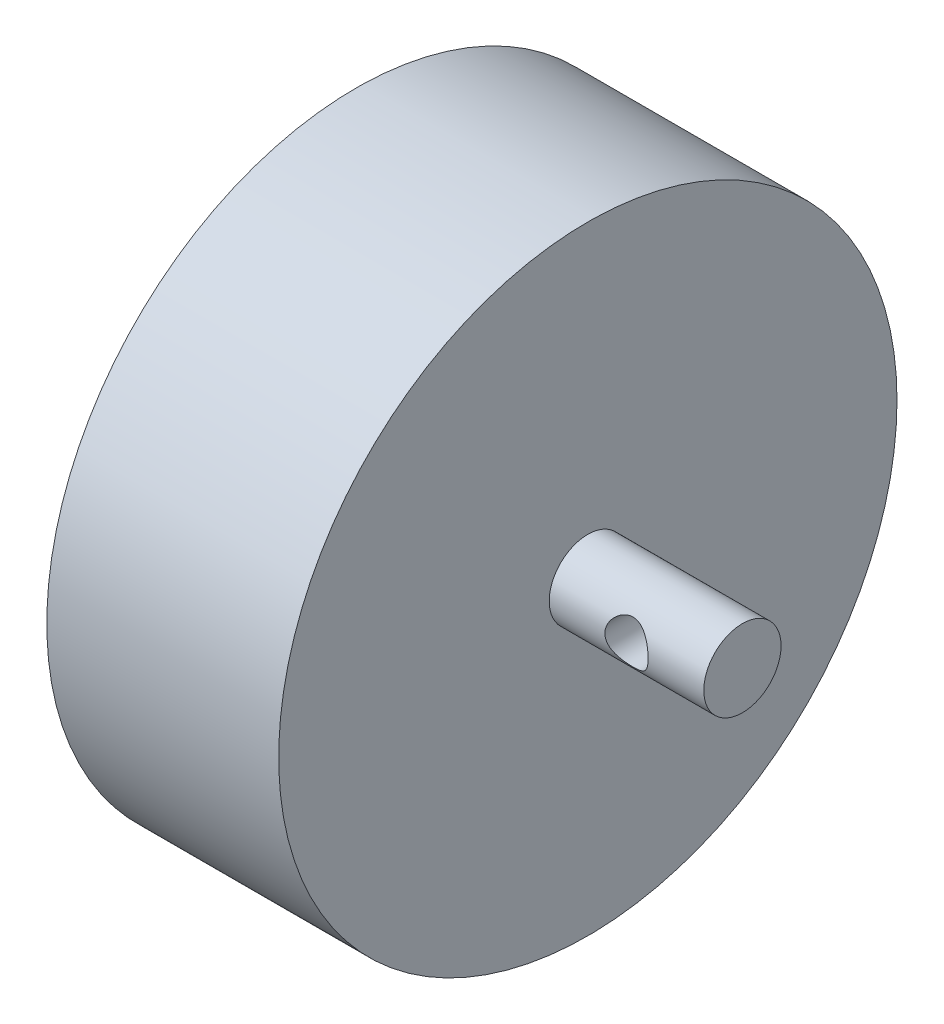
ISO-10303-21;
HEADER;
FILE_DESCRIPTION(('STEP AP214'),'2;1');
FILE_NAME('part.step','',(''),(''),'','','');
FILE_SCHEMA(('AUTOMOTIVE_DESIGN { 1 0 10303 214 1 1 1 1 }'));
ENDSEC;
DATA;
#1=APPLICATION_CONTEXT('core data for automotive mechanical design processes');
#2=APPLICATION_PROTOCOL_DEFINITION('international standard','automotive_design',2000,#1);
#3=PRODUCT_CONTEXT('',#1,'mechanical');
#4=PRODUCT('Part','Part','',(#3));
#5=PRODUCT_RELATED_PRODUCT_CATEGORY('part','',(#4));
#6=PRODUCT_DEFINITION_FORMATION('','',#4);
#7=PRODUCT_DEFINITION_CONTEXT('part definition',#1,'design');
#8=PRODUCT_DEFINITION('design','',#6,#7);
#9=PRODUCT_DEFINITION_SHAPE('','',#8);
#10=(LENGTH_UNIT() NAMED_UNIT(*) SI_UNIT(.MILLI.,.METRE.));
#11=(NAMED_UNIT(*) PLANE_ANGLE_UNIT() SI_UNIT($,.RADIAN.));
#12=(NAMED_UNIT(*) SI_UNIT($,.STERADIAN.) SOLID_ANGLE_UNIT());
#13=UNCERTAINTY_MEASURE_WITH_UNIT(LENGTH_MEASURE(1.E-05),#10,'distance_accuracy_value','');
#14=(GEOMETRIC_REPRESENTATION_CONTEXT(3) GLOBAL_UNCERTAINTY_ASSIGNED_CONTEXT((#13)) GLOBAL_UNIT_ASSIGNED_CONTEXT((#10,
#11,#12)) REPRESENTATION_CONTEXT('',''));
#15=CARTESIAN_POINT('',(0.,0.,0.));
#16=DIRECTION('',(0.,0.,1.));
#17=DIRECTION('',(1.,0.,0.));
#18=AXIS2_PLACEMENT_3D('',#15,#16,#17);
#19=CARTESIAN_POINT('',(3.,0.,0.));
#20=DIRECTION('',(1.,0.,0.));
#21=DIRECTION('',(0.,0.,-1.));
#22=AXIS2_PLACEMENT_3D('',#19,#20,#21);
#23=PLANE('',#22);
#24=CARTESIAN_POINT('',(3.,0.,6.5));
#25=DIRECTION('',(-1.,0.,0.));
#26=DIRECTION('',(0.,0.,1.));
#27=AXIS2_PLACEMENT_3D('',#24,#25,#26);
#28=CIRCLE('',#27,1.25);
#29=CARTESIAN_POINT('',(3.,0.,7.75));
#30=VERTEX_POINT('',#29);
#31=EDGE_CURVE('E80',#30,#30,#28,.T.);
#32=ORIENTED_EDGE('',*,*,#31,.F.);
#33=EDGE_LOOP('',(#32));
#34=FACE_BOUND('',#33,.T.);
#35=CARTESIAN_POINT('',(3.,-6.5,0.));
#36=DIRECTION('',(-1.,0.,0.));
#37=DIRECTION('',(0.,0.,1.));
#38=AXIS2_PLACEMENT_3D('',#35,#36,#37);
#39=CIRCLE('',#38,1.25);
#40=CARTESIAN_POINT('',(3.,-6.5,1.25));
#41=VERTEX_POINT('',#40);
#42=EDGE_CURVE('E79',#41,#41,#39,.T.);
#43=ORIENTED_EDGE('',*,*,#42,.F.);
#44=EDGE_LOOP('',(#43));
#45=FACE_BOUND('',#44,.T.);
#46=CARTESIAN_POINT('',(3.,0.,-6.5));
#47=DIRECTION('',(-1.,0.,0.));
#48=DIRECTION('',(0.,0.,1.));
#49=AXIS2_PLACEMENT_3D('',#46,#47,#48);
#50=CIRCLE('',#49,1.25);
#51=CARTESIAN_POINT('',(3.,0.,-5.25));
#52=VERTEX_POINT('',#51);
#53=EDGE_CURVE('E90',#52,#52,#50,.T.);
#54=ORIENTED_EDGE('',*,*,#53,.F.);
#55=EDGE_LOOP('',(#54));
#56=FACE_BOUND('',#55,.T.);
#57=CARTESIAN_POINT('',(3.,0.,0.));
#58=DIRECTION('',(1.,0.,0.));
#59=DIRECTION('',(0.,0.,-1.));
#60=AXIS2_PLACEMENT_3D('',#57,#58,#59);
#61=CIRCLE('',#60,3.5);
#62=CARTESIAN_POINT('',(3.,0.,-3.5));
#63=VERTEX_POINT('',#62);
#64=EDGE_CURVE('E11',#63,#63,#61,.T.);
#65=ORIENTED_EDGE('',*,*,#64,.T.);
#66=EDGE_LOOP('',(#65));
#67=FACE_BOUND('',#66,.T.);
#68=CARTESIAN_POINT('',(3.,0.,0.));
#69=DIRECTION('',(1.,0.,0.));
#70=DIRECTION('',(0.,0.,-1.));
#71=AXIS2_PLACEMENT_3D('',#68,#69,#70);
#72=CIRCLE('',#71,20.);
#73=CARTESIAN_POINT('',(3.,0.,-20.));
#74=VERTEX_POINT('',#73);
#75=EDGE_CURVE('E106',#74,#74,#72,.T.);
#76=ORIENTED_EDGE('',*,*,#75,.F.);
#77=EDGE_LOOP('',(#76));
#78=FACE_BOUND('',#77,.T.);
#79=CARTESIAN_POINT('',(3.,6.5,0.));
#80=DIRECTION('',(-1.,0.,0.));
#81=DIRECTION('',(0.,0.,1.));
#82=AXIS2_PLACEMENT_3D('',#79,#80,#81);
#83=CIRCLE('',#82,1.25);
#84=CARTESIAN_POINT('',(3.,6.5,1.25));
#85=VERTEX_POINT('',#84);
#86=EDGE_CURVE('E96',#85,#85,#83,.T.);
#87=ORIENTED_EDGE('',*,*,#86,.F.);
#88=EDGE_LOOP('',(#87));
#89=FACE_BOUND('',#88,.T.);
#90=ADVANCED_FACE('F41',(#34,#45,#56,#67,#78,#89),#23,.F.);
#91=CARTESIAN_POINT('',(28.,0.,0.));
#92=DIRECTION('',(-1.,0.,0.));
#93=DIRECTION('',(0.,0.,1.));
#94=AXIS2_PLACEMENT_3D('',#91,#92,#93);
#95=CYLINDRICAL_SURFACE('',#94,2.5);
#96=CARTESIAN_POINT('',(28.,0.,0.));
#97=DIRECTION('',(1.,0.,0.));
#98=DIRECTION('',(0.,0.,-1.));
#99=AXIS2_PLACEMENT_3D('',#96,#97,#98);
#100=CIRCLE('',#99,2.5);
#101=CARTESIAN_POINT('',(28.,0.,-2.5));
#102=VERTEX_POINT('',#101);
#103=EDGE_CURVE('E103',#102,#102,#100,.T.);
#104=ORIENTED_EDGE('',*,*,#103,.F.);
#105=EDGE_LOOP('',(#104));
#106=FACE_BOUND('',#105,.T.);
#107=CARTESIAN_POINT('',(18.,0.,0.));
#108=DIRECTION('',(1.,0.,0.));
#109=DIRECTION('',(0.,0.,-1.));
#110=AXIS2_PLACEMENT_3D('',#107,#108,#109);
#111=CIRCLE('',#110,2.5);
#112=CARTESIAN_POINT('',(18.,0.,-2.5));
#113=VERTEX_POINT('',#112);
#114=EDGE_CURVE('E107',#113,#113,#111,.T.);
#115=ORIENTED_EDGE('',*,*,#114,.T.);
#116=EDGE_LOOP('',(#115));
#117=FACE_BOUND('',#116,.T.);
#118=CARTESIAN_POINT('',(21.6,0.,-2.5));
#119=CARTESIAN_POINT('',(21.5999971034013,0.0725818689730917,-2.5000025207769));
#120=CARTESIAN_POINT('',(21.6056686696437,0.145147059210999,-2.4968126130914));
#121=CARTESIAN_POINT('',(21.6280397874393,0.288016997267102,-2.48438893882109));
#122=CARTESIAN_POINT('',(21.6447407304683,0.35832145869601,-2.47515440964292));
#123=CARTESIAN_POINT('',(21.6882875901928,0.494475170763166,-2.4515826362878));
#124=CARTESIAN_POINT('',(21.7150961271458,0.560339795458176,-2.4372642045506));
#125=CARTESIAN_POINT('',(21.7778409702233,0.686510478104349,-2.40477714167671));
#126=CARTESIAN_POINT('',(21.8137795115382,0.746815169948826,-2.38660756789146));
#127=CARTESIAN_POINT('',(21.8965929323298,0.864901258370252,-2.34650853836439));
#128=CARTESIAN_POINT('',(21.9440586544966,0.922207928188874,-2.32440463450632));
#129=CARTESIAN_POINT('',(22.047278741539,1.02850336667495,-2.27936832535399));
#130=CARTESIAN_POINT('',(22.1030416344691,1.07748346476577,-2.25643508622409));
#131=CARTESIAN_POINT('',(22.228110571729,1.17085060892693,-2.20954965541892));
#132=CARTESIAN_POINT('',(22.2982207513902,1.21423931000865,-2.18573723286096));
#133=CARTESIAN_POINT('',(22.446118759996,1.28842263311707,-2.14285181690115));
#134=CARTESIAN_POINT('',(22.5238952276818,1.31923555387748,-2.12377195324334));
#135=CARTESIAN_POINT('',(22.6679140789319,1.3616501036544,-2.09675966314441));
#136=CARTESIAN_POINT('',(22.7330793356759,1.37594726130742,-2.08731773527896));
#137=CARTESIAN_POINT('',(22.8653466905762,1.3951063945149,-2.07456424572643));
#138=CARTESIAN_POINT('',(22.9324467656657,1.39997788675499,-2.0712465008732));
#139=CARTESIAN_POINT('',(23.0667273688799,1.40002199297853,-2.07121661581743));
#140=CARTESIAN_POINT('',(23.1339078995773,1.39518329024686,-2.07451218307788));
#141=CARTESIAN_POINT('',(23.2663252466788,1.37606434146031,-2.08724063955166));
#142=CARTESIAN_POINT('',(23.3315607496216,1.3617778598451,-2.09667758202417));
#143=CARTESIAN_POINT('',(23.4584357281997,1.32446590427588,-2.12044163026771));
#144=CARTESIAN_POINT('',(23.5200782424142,1.30144794194266,-2.13476453162494));
#145=CARTESIAN_POINT('',(23.6388266018562,1.24746154369203,-2.16675385560416));
#146=CARTESIAN_POINT('',(23.6959306724878,1.21649001765185,-2.18442157705475));
#147=CARTESIAN_POINT('',(23.81333339005,1.14194614545546,-2.22441210553114));
#148=CARTESIAN_POINT('',(23.8727655212571,1.09716690393685,-2.24703255727838));
#149=CARTESIAN_POINT('',(23.9838179532412,0.998804901734399,-2.29245003438464));
#150=CARTESIAN_POINT('',(24.0354318843283,0.945215036141926,-2.31524718798208));
#151=CARTESIAN_POINT('',(24.1348052671212,0.824002455402962,-2.36128035281545));
#152=CARTESIAN_POINT('',(24.1815943321778,0.755497761421244,-2.38431210459901));
#153=CARTESIAN_POINT('',(24.262773509807,0.610176383485677,-2.42556670348269));
#154=CARTESIAN_POINT('',(24.2971717058745,0.533365161191363,-2.44379268366085));
#155=CARTESIAN_POINT('',(24.3499447244115,0.379219300123219,-2.47222426509628));
#156=CARTESIAN_POINT('',(24.3692783180377,0.302303425618088,-2.48290475975753));
#157=CARTESIAN_POINT('',(24.3946518880584,0.145680772914425,-2.49698582081013));
#158=CARTESIAN_POINT('',(24.4007039746224,0.065976604540732,-2.5003930189659));
#159=CARTESIAN_POINT('',(24.3992526196861,-0.0840088573455033,-2.49958253553248));
#160=CARTESIAN_POINT('',(24.3932347104734,-0.154314771743416,-2.49620041503358));
#161=CARTESIAN_POINT('',(24.3708471787942,-0.292732551809141,-2.48377435305127));
#162=CARTESIAN_POINT('',(24.3544772612816,-0.360844354883693,-2.47473025019386));
#163=CARTESIAN_POINT('',(24.3122383189219,-0.492752800665482,-2.45186816628827));
#164=CARTESIAN_POINT('',(24.2864213077176,-0.556570848252343,-2.43807634930447));
#165=CARTESIAN_POINT('',(24.2262033961865,-0.679033093012461,-2.40684706634307));
#166=CARTESIAN_POINT('',(24.1918002639424,-0.737675939545725,-2.38940865264309));
#167=CARTESIAN_POINT('',(24.1113616431687,-0.85464758636355,-2.35026880598828));
#168=CARTESIAN_POINT('',(24.0644909391045,-0.912316233413863,-2.32831298394221));
#169=CARTESIAN_POINT('',(23.962431001857,-1.01941549241508,-2.28345593500925));
#170=CARTESIAN_POINT('',(23.9072325038943,-1.06883679847808,-2.26055367606601));
#171=CARTESIAN_POINT('',(23.7833012556651,-1.16323731293619,-2.21357993795462));
#172=CARTESIAN_POINT('',(23.7137584760601,-1.20722360376429,-2.18963369204043));
#173=CARTESIAN_POINT('',(23.566931533571,-1.28272281277869,-2.14628222162434));
#174=CARTESIAN_POINT('',(23.4896583606332,-1.31425313191436,-2.12687067777325));
#175=CARTESIAN_POINT('',(23.3461566386078,-1.35814700997933,-2.09903909958624));
#176=CARTESIAN_POINT('',(23.2810161676393,-1.37314501906902,-2.08916693682541));
#177=CARTESIAN_POINT('',(23.1486607049443,-1.39369032223819,-2.07552058815552));
#178=CARTESIAN_POINT('',(23.0814479394138,-1.39924742133139,-2.07174007587244));
#179=CARTESIAN_POINT('',(22.9467806386368,-1.40061028195421,-2.0708191382455));
#180=CARTESIAN_POINT('',(22.8793258943516,-1.39640193637515,-2.07368831900493));
#181=CARTESIAN_POINT('',(22.7462537804279,-1.37845110967393,-2.08566145783698));
#182=CARTESIAN_POINT('',(22.6806376132689,-1.36470253372663,-2.09476940152745));
#183=CARTESIAN_POINT('',(22.5533246916661,-1.32847150200962,-2.11792732652032));
#184=CARTESIAN_POINT('',(22.491604304692,-1.30604911543395,-2.13194325635333));
#185=CARTESIAN_POINT('',(22.3726207113778,-1.25325063054657,-2.16340129463321));
#186=CARTESIAN_POINT('',(22.3153592151908,-1.22287149982576,-2.1808447087003));
#187=CARTESIAN_POINT('',(22.1976762316304,-1.14968661812875,-2.22040526472663));
#188=CARTESIAN_POINT('',(22.1380951250878,-1.10569440990223,-2.24282990054019));
#189=CARTESIAN_POINT('',(22.0266105148073,-1.00894376720332,-2.28798739767774));
#190=CARTESIAN_POINT('',(21.9747133225061,-0.95617820113343,-2.31072049582112));
#191=CARTESIAN_POINT('',(21.8743424399434,-0.836446621131473,-2.35688482150115));
#192=CARTESIAN_POINT('',(21.8268679680855,-0.76855795891554,-2.38011931516563));
#193=CARTESIAN_POINT('',(21.7441923865162,-0.624371405225459,-2.42193730695592));
#194=CARTESIAN_POINT('',(21.708983953494,-0.548078567315723,-2.44052357837763));
#195=CARTESIAN_POINT('',(21.654367800848,-0.394320657231991,-2.4698645459765));
#196=CARTESIAN_POINT('',(21.6340843630634,-0.317251581329472,-2.4810485262019));
#197=CARTESIAN_POINT('',(21.6069080250895,-0.160113082948894,-2.49611160908086));
#198=CARTESIAN_POINT('',(21.6000031944933,-0.0800463986147508,-2.4999972199791));
#199=CARTESIAN_POINT('',(21.6,0.,-2.5));
#200=B_SPLINE_CURVE_WITH_KNOTS('',3,(#118,#119,#120,#121,#122,#123,#124,#125,#126,#127,#128,
#129,#130,#131,#132,#133,#134,#135,#136,#137,#138,#139,#140,#141,#142,#143,#144,#145,#146,#147,
#148,#149,#150,#151,#152,#153,#154,#155,#156,#157,#158,#159,#160,#161,#162,#163,#164,#165,#166,
#167,#168,#169,#170,#171,#172,#173,#174,#175,#176,#177,#178,#179,#180,#181,#182,#183,#184,#185,
#186,#187,#188,#189,#190,#191,#192,#193,#194,#195,#196,#197,#198,#199),.UNSPECIFIED.,.T.,.F.,(4,
2,2,2,2,2,2,2,2,2,2,2,2,2,2,2,2,2,2,2,2,2,2,2,2,2,2,2,2,2,2,2,2,2,2,2,2,2,2,2,4),(0.,
0.217435512517166,0.434898462127869,0.651564958945522,0.868284550848013,1.10022589213456,
1.33240729712488,1.58859231253332,1.84440321838643,2.04566432080885,2.24672211236853,
2.44801436216047,2.64943959816538,2.85069194125705,3.05202259362406,3.28441685131827,
3.51699943986532,3.77394969791921,4.03073202312733,4.26940910410352,4.50786846709432,
4.71877390395926,4.92968535218223,5.13945262304555,5.34927447871155,5.58080367166495,
5.81259236960018,6.06843034205974,6.32390963505653,6.52574183023126,6.72736428079795,
6.92927817535459,7.13132118254213,7.33198932166182,7.53273404934171,7.76395996958625,
7.99537477361486,8.25216210224235,8.50879585486681,8.74880719470861,8.98860440514424),.UNSPECIFIED.);
#201=CARTESIAN_POINT('',(21.6,0.,-2.5));
#202=VERTEX_POINT('',#201);
#203=EDGE_CURVE('E102',#202,#202,#200,.T.);
#204=ORIENTED_EDGE('',*,*,#203,.F.);
#205=EDGE_LOOP('',(#204));
#206=FACE_BOUND('',#205,.T.);
#207=CARTESIAN_POINT('',(24.4,0.,2.5));
#208=CARTESIAN_POINT('',(24.4000028965987,0.0725818689730917,2.5000025207769));
#209=CARTESIAN_POINT('',(24.3943313303563,0.145147059210999,2.4968126130914));
#210=CARTESIAN_POINT('',(24.3719602125607,0.288016997267102,2.48438893882109));
#211=CARTESIAN_POINT('',(24.3552592695317,0.35832145869601,2.47515440964292));
#212=CARTESIAN_POINT('',(24.3117124098072,0.494475170763166,2.4515826362878));
#213=CARTESIAN_POINT('',(24.2849038728542,0.560339795458176,2.4372642045506));
#214=CARTESIAN_POINT('',(24.2221590297767,0.686510478104349,2.40477714167671));
#215=CARTESIAN_POINT('',(24.1862204884618,0.746815169948826,2.38660756789146));
#216=CARTESIAN_POINT('',(24.1034070676702,0.864901258370252,2.34650853836439));
#217=CARTESIAN_POINT('',(24.0559413455034,0.922207928188874,2.32440463450632));
#218=CARTESIAN_POINT('',(23.952721258461,1.02850336667495,2.27936832535399));
#219=CARTESIAN_POINT('',(23.8969583655309,1.07748346476577,2.25643508622409));
#220=CARTESIAN_POINT('',(23.771889428271,1.17085060892693,2.20954965541892));
#221=CARTESIAN_POINT('',(23.7017792486098,1.21423931000865,2.18573723286096));
#222=CARTESIAN_POINT('',(23.553881240004,1.28842263311707,2.14285181690115));
#223=CARTESIAN_POINT('',(23.4761047723182,1.31923555387748,2.12377195324334));
#224=CARTESIAN_POINT('',(23.3320859210681,1.3616501036544,2.09675966314441));
#225=CARTESIAN_POINT('',(23.2669206643241,1.37594726130742,2.08731773527896));
#226=CARTESIAN_POINT('',(23.1346533094238,1.3951063945149,2.07456424572643));
#227=CARTESIAN_POINT('',(23.0675532343343,1.39997788675499,2.0712465008732));
#228=CARTESIAN_POINT('',(22.9332726311201,1.40002199297853,2.07121661581743));
#229=CARTESIAN_POINT('',(22.8660921004227,1.39518329024686,2.07451218307788));
#230=CARTESIAN_POINT('',(22.7336747533212,1.37606434146031,2.08724063955166));
#231=CARTESIAN_POINT('',(22.6684392503784,1.3617778598451,2.09667758202417));
#232=CARTESIAN_POINT('',(22.5415642718003,1.32446590427588,2.12044163026771));
#233=CARTESIAN_POINT('',(22.4799217575858,1.30144794194266,2.13476453162494));
#234=CARTESIAN_POINT('',(22.3611733981438,1.24746154369203,2.16675385560416));
#235=CARTESIAN_POINT('',(22.3040693275122,1.21649001765185,2.18442157705475));
#236=CARTESIAN_POINT('',(22.18666660995,1.14194614545546,2.22441210553114));
#237=CARTESIAN_POINT('',(22.1272344787429,1.09716690393685,2.24703255727838));
#238=CARTESIAN_POINT('',(22.0161820467588,0.998804901734399,2.29245003438464));
#239=CARTESIAN_POINT('',(21.9645681156717,0.945215036141926,2.31524718798208));
#240=CARTESIAN_POINT('',(21.8651947328788,0.824002455402962,2.36128035281545));
#241=CARTESIAN_POINT('',(21.8184056678222,0.755497761421244,2.38431210459901));
#242=CARTESIAN_POINT('',(21.737226490193,0.610176383485677,2.42556670348269));
#243=CARTESIAN_POINT('',(21.7028282941255,0.533365161191363,2.44379268366085));
#244=CARTESIAN_POINT('',(21.6500552755885,0.379219300123219,2.47222426509628));
#245=CARTESIAN_POINT('',(21.6307216819623,0.302303425618088,2.48290475975753));
#246=CARTESIAN_POINT('',(21.6053481119416,0.145680772914425,2.49698582081013));
#247=CARTESIAN_POINT('',(21.5992960253776,0.065976604540732,2.5003930189659));
#248=CARTESIAN_POINT('',(21.6007473803139,-0.0840088573455033,2.49958253553248));
#249=CARTESIAN_POINT('',(21.6067652895266,-0.154314771743416,2.49620041503358));
#250=CARTESIAN_POINT('',(21.6291528212058,-0.292732551809141,2.48377435305127));
#251=CARTESIAN_POINT('',(21.6455227387184,-0.360844354883693,2.47473025019386));
#252=CARTESIAN_POINT('',(21.6877616810781,-0.492752800665482,2.45186816628827));
#253=CARTESIAN_POINT('',(21.7135786922824,-0.556570848252343,2.43807634930447));
#254=CARTESIAN_POINT('',(21.7737966038135,-0.679033093012461,2.40684706634307));
#255=CARTESIAN_POINT('',(21.8081997360576,-0.737675939545725,2.38940865264309));
#256=CARTESIAN_POINT('',(21.8886383568313,-0.854647586363548,2.35026880598828));
#257=CARTESIAN_POINT('',(21.9355090608955,-0.912316233413859,2.32831298394221));
#258=CARTESIAN_POINT('',(22.037568998143,-1.01941549241508,2.28345593500925));
#259=CARTESIAN_POINT('',(22.0927674961057,-1.06883679847808,2.26055367606601));
#260=CARTESIAN_POINT('',(22.2166987443349,-1.16323731293619,2.21357993795462));
#261=CARTESIAN_POINT('',(22.2862415239399,-1.20722360376429,2.18963369204043));
#262=CARTESIAN_POINT('',(22.433068466429,-1.28272281277869,2.14628222162434));
#263=CARTESIAN_POINT('',(22.5103416393668,-1.31425313191436,2.12687067777325));
#264=CARTESIAN_POINT('',(22.6538433613922,-1.35814700997933,2.09903909958624));
#265=CARTESIAN_POINT('',(22.7189838323607,-1.37314501906902,2.08916693682541));
#266=CARTESIAN_POINT('',(22.8513392950557,-1.39369032223819,2.07552058815552));
#267=CARTESIAN_POINT('',(22.9185520605862,-1.39924742133139,2.07174007587244));
#268=CARTESIAN_POINT('',(23.0532193613632,-1.40061028195421,2.0708191382455));
#269=CARTESIAN_POINT('',(23.1206741056484,-1.39640193637515,2.07368831900493));
#270=CARTESIAN_POINT('',(23.2537462195721,-1.37845110967393,2.08566145783698));
#271=CARTESIAN_POINT('',(23.3193623867311,-1.36470253372663,2.09476940152745));
#272=CARTESIAN_POINT('',(23.4466753083339,-1.32847150200962,2.11792732652032));
#273=CARTESIAN_POINT('',(23.508395695308,-1.30604911543395,2.13194325635333));
#274=CARTESIAN_POINT('',(23.6273792886222,-1.25325063054657,2.16340129463321));
#275=CARTESIAN_POINT('',(23.6846407848092,-1.22287149982576,2.1808447087003));
#276=CARTESIAN_POINT('',(23.8023237683696,-1.14968661812875,2.22040526472663));
#277=CARTESIAN_POINT('',(23.8619048749122,-1.10569440990223,2.24282990054019));
#278=CARTESIAN_POINT('',(23.9733894851927,-1.00894376720332,2.28798739767774));
#279=CARTESIAN_POINT('',(24.0252866774939,-0.95617820113343,2.31072049582112));
#280=CARTESIAN_POINT('',(24.1256575600566,-0.836446621131473,2.35688482150115));
#281=CARTESIAN_POINT('',(24.1731320319145,-0.76855795891554,2.38011931516563));
#282=CARTESIAN_POINT('',(24.2558076134838,-0.624371405225459,2.42193730695592));
#283=CARTESIAN_POINT('',(24.291016046506,-0.548078567315723,2.44052357837763));
#284=CARTESIAN_POINT('',(24.345632199152,-0.394320657231991,2.4698645459765));
#285=CARTESIAN_POINT('',(24.3659156369366,-0.317251581329472,2.4810485262019));
#286=CARTESIAN_POINT('',(24.3930919749105,-0.160113082948894,2.49611160908086));
#287=CARTESIAN_POINT('',(24.3999968055067,-0.0800463986147508,2.4999972199791));
#288=CARTESIAN_POINT('',(24.4,0.,2.5));
#289=B_SPLINE_CURVE_WITH_KNOTS('',3,(#207,#208,#209,#210,#211,#212,#213,#214,#215,#216,#217,
#218,#219,#220,#221,#222,#223,#224,#225,#226,#227,#228,#229,#230,#231,#232,#233,#234,#235,#236,
#237,#238,#239,#240,#241,#242,#243,#244,#245,#246,#247,#248,#249,#250,#251,#252,#253,#254,#255,
#256,#257,#258,#259,#260,#261,#262,#263,#264,#265,#266,#267,#268,#269,#270,#271,#272,#273,#274,
#275,#276,#277,#278,#279,#280,#281,#282,#283,#284,#285,#286,#287,#288),.UNSPECIFIED.,.T.,.F.,(4,
2,2,2,2,2,2,2,2,2,2,2,2,2,2,2,2,2,2,2,2,2,2,2,2,2,2,2,2,2,2,2,2,2,2,2,2,2,2,2,4),(0.,
0.217435512517166,0.434898462127869,0.651564958945522,0.868284550848013,1.10022589213456,
1.33240729712488,1.58859231253332,1.84440321838643,2.04566432080885,2.24672211236853,
2.44801436216047,2.64943959816538,2.85069194125705,3.05202259362406,3.28441685131827,
3.51699943986532,3.77394969791921,4.03073202312733,4.26940910410352,4.50786846709432,
4.71877390395926,4.92968535218223,5.13945262304555,5.34927447871155,5.58080367166494,
5.81259236960018,6.06843034205974,6.32390963505653,6.52574183023126,6.72736428079795,
6.92927817535459,7.13132118254213,7.33198932166182,7.53273404934171,7.76395996958625,
7.99537477361486,8.25216210224235,8.50879585486681,8.74880719470861,8.98860440514424),.UNSPECIFIED.);
#290=CARTESIAN_POINT('',(24.4,0.,2.5));
#291=VERTEX_POINT('',#290);
#292=EDGE_CURVE('E45',#291,#291,#289,.T.);
#293=ORIENTED_EDGE('',*,*,#292,.F.);
#294=EDGE_LOOP('',(#293));
#295=FACE_BOUND('',#294,.T.);
#296=ADVANCED_FACE('F120',(#106,#117,#206,#295),#95,.T.);
#297=CARTESIAN_POINT('',(3.,0.,0.));
#298=DIRECTION('',(-1.,0.,0.));
#299=DIRECTION('',(0.,0.,1.));
#300=AXIS2_PLACEMENT_3D('',#297,#298,#299);
#301=CYLINDRICAL_SURFACE('',#300,3.5);
#302=ORIENTED_EDGE('',*,*,#64,.F.);
#303=EDGE_LOOP('',(#302));
#304=FACE_BOUND('',#303,.T.);
#305=CARTESIAN_POINT('',(0.,0.,0.));
#306=DIRECTION('',(1.,0.,0.));
#307=DIRECTION('',(0.,0.,-1.));
#308=AXIS2_PLACEMENT_3D('',#305,#306,#307);
#309=CIRCLE('',#308,3.5);
#310=CARTESIAN_POINT('',(0.,0.,-3.5));
#311=VERTEX_POINT('',#310);
#312=EDGE_CURVE('E55',#311,#311,#309,.T.);
#313=ORIENTED_EDGE('',*,*,#312,.T.);
#314=EDGE_LOOP('',(#313));
#315=FACE_BOUND('',#314,.T.);
#316=ADVANCED_FACE('F43',(#304,#315),#301,.T.);
#317=CARTESIAN_POINT('',(0.,0.,0.));
#318=DIRECTION('',(1.,0.,0.));
#319=DIRECTION('',(0.,0.,-1.));
#320=AXIS2_PLACEMENT_3D('',#317,#318,#319);
#321=PLANE('',#320);
#322=ORIENTED_EDGE('',*,*,#312,.F.);
#323=EDGE_LOOP('',(#322));
#324=FACE_BOUND('',#323,.T.);
#325=ADVANCED_FACE('F154',(#324),#321,.F.);
#326=CARTESIAN_POINT('',(18.,0.,0.));
#327=DIRECTION('',(-1.,0.,0.));
#328=DIRECTION('',(0.,0.,1.));
#329=AXIS2_PLACEMENT_3D('',#326,#327,#328);
#330=CYLINDRICAL_SURFACE('',#329,20.);
#331=CARTESIAN_POINT('',(18.,0.,0.));
#332=DIRECTION('',(1.,0.,0.));
#333=DIRECTION('',(0.,0.,-1.));
#334=AXIS2_PLACEMENT_3D('',#331,#332,#333);
#335=CIRCLE('',#334,20.);
#336=CARTESIAN_POINT('',(18.,0.,-20.));
#337=VERTEX_POINT('',#336);
#338=EDGE_CURVE('E110',#337,#337,#335,.T.);
#339=ORIENTED_EDGE('',*,*,#338,.F.);
#340=EDGE_LOOP('',(#339));
#341=FACE_BOUND('',#340,.T.);
#342=ORIENTED_EDGE('',*,*,#75,.T.);
#343=EDGE_LOOP('',(#342));
#344=FACE_BOUND('',#343,.T.);
#345=ADVANCED_FACE('F140',(#341,#344),#330,.T.);
#346=CARTESIAN_POINT('',(18.,0.,0.));
#347=DIRECTION('',(1.,0.,0.));
#348=DIRECTION('',(0.,0.,-1.));
#349=AXIS2_PLACEMENT_3D('',#346,#347,#348);
#350=PLANE('',#349);
#351=ORIENTED_EDGE('',*,*,#114,.F.);
#352=EDGE_LOOP('',(#351));
#353=FACE_BOUND('',#352,.T.);
#354=ORIENTED_EDGE('',*,*,#338,.T.);
#355=EDGE_LOOP('',(#354));
#356=FACE_BOUND('',#355,.T.);
#357=ADVANCED_FACE('F134',(#353,#356),#350,.T.);
#358=CARTESIAN_POINT('',(28.,0.,0.));
#359=DIRECTION('',(1.,0.,0.));
#360=DIRECTION('',(0.,0.,-1.));
#361=AXIS2_PLACEMENT_3D('',#358,#359,#360);
#362=PLANE('',#361);
#363=ORIENTED_EDGE('',*,*,#103,.T.);
#364=EDGE_LOOP('',(#363));
#365=FACE_BOUND('',#364,.T.);
#366=ADVANCED_FACE('F129',(#365),#362,.T.);
#367=CARTESIAN_POINT('',(23.,0.,10.));
#368=DIRECTION('',(0.,0.,-1.));
#369=DIRECTION('',(-1.,0.,0.));
#370=AXIS2_PLACEMENT_3D('',#367,#368,#369);
#371=CYLINDRICAL_SURFACE('',#370,1.4);
#372=ORIENTED_EDGE('',*,*,#203,.T.);
#373=EDGE_LOOP('',(#372));
#374=FACE_BOUND('',#373,.T.);
#375=ORIENTED_EDGE('',*,*,#292,.T.);
#376=EDGE_LOOP('',(#375));
#377=FACE_BOUND('',#376,.T.);
#378=ADVANCED_FACE('F124',(#374,#377),#371,.F.);
#379=CARTESIAN_POINT('',(9.74892422621555,6.5,0.));
#380=DIRECTION('',(-1.,0.,0.));
#381=DIRECTION('',(0.,0.,1.));
#382=AXIS2_PLACEMENT_3D('',#379,#380,#381);
#383=CONICAL_SURFACE('',#382,1.25,1.02974425867665);
#384=CARTESIAN_POINT('',(10.5,6.5,0.));
#385=VERTEX_POINT('',#384);
#386=VERTEX_LOOP('',#385);
#387=FACE_BOUND('',#386,.T.);
#388=CARTESIAN_POINT('',(9.74892422621555,6.5,0.));
#389=DIRECTION('',(-1.,0.,0.));
#390=DIRECTION('',(0.,0.,1.));
#391=AXIS2_PLACEMENT_3D('',#388,#389,#390);
#392=CIRCLE('',#391,1.25);
#393=CARTESIAN_POINT('',(9.74892422621555,6.5,1.25));
#394=VERTEX_POINT('',#393);
#395=EDGE_CURVE('E99',#394,#394,#392,.T.);
#396=ORIENTED_EDGE('',*,*,#395,.T.);
#397=EDGE_LOOP('',(#396));
#398=FACE_BOUND('',#397,.T.);
#399=ADVANCED_FACE('F128',(#387,#398),#383,.F.);
#400=CARTESIAN_POINT('',(3.,6.5,0.));
#401=DIRECTION('',(-1.,0.,0.));
#402=DIRECTION('',(0.,0.,1.));
#403=AXIS2_PLACEMENT_3D('',#400,#401,#402);
#404=CYLINDRICAL_SURFACE('',#403,1.25);
#405=ORIENTED_EDGE('',*,*,#395,.F.);
#406=EDGE_LOOP('',(#405));
#407=FACE_BOUND('',#406,.T.);
#408=ORIENTED_EDGE('',*,*,#86,.T.);
#409=EDGE_LOOP('',(#408));
#410=FACE_BOUND('',#409,.T.);
#411=ADVANCED_FACE('F173',(#407,#410),#404,.F.);
#412=CARTESIAN_POINT('',(9.74892422621555,0.,-6.5));
#413=DIRECTION('',(-1.,0.,0.));
#414=DIRECTION('',(0.,0.,1.));
#415=AXIS2_PLACEMENT_3D('',#412,#413,#414);
#416=CONICAL_SURFACE('',#415,1.25,1.02974425867665);
#417=CARTESIAN_POINT('',(10.5,0.,-6.5));
#418=VERTEX_POINT('',#417);
#419=VERTEX_LOOP('',#418);
#420=FACE_BOUND('',#419,.T.);
#421=CARTESIAN_POINT('',(9.74892422621555,0.,-6.5));
#422=DIRECTION('',(-1.,0.,0.));
#423=DIRECTION('',(0.,0.,1.));
#424=AXIS2_PLACEMENT_3D('',#421,#422,#423);
#425=CIRCLE('',#424,1.25);
#426=CARTESIAN_POINT('',(9.74892422621555,0.,-5.25));
#427=VERTEX_POINT('',#426);
#428=EDGE_CURVE('E93',#427,#427,#425,.T.);
#429=ORIENTED_EDGE('',*,*,#428,.T.);
#430=EDGE_LOOP('',(#429));
#431=FACE_BOUND('',#430,.T.);
#432=ADVANCED_FACE('F175',(#420,#431),#416,.F.);
#433=CARTESIAN_POINT('',(3.,0.,-6.5));
#434=DIRECTION('',(-1.,0.,0.));
#435=DIRECTION('',(0.,0.,1.));
#436=AXIS2_PLACEMENT_3D('',#433,#434,#435);
#437=CYLINDRICAL_SURFACE('',#436,1.25);
#438=ORIENTED_EDGE('',*,*,#428,.F.);
#439=EDGE_LOOP('',(#438));
#440=FACE_BOUND('',#439,.T.);
#441=ORIENTED_EDGE('',*,*,#53,.T.);
#442=EDGE_LOOP('',(#441));
#443=FACE_BOUND('',#442,.T.);
#444=ADVANCED_FACE('F181',(#440,#443),#437,.F.);
#445=CARTESIAN_POINT('',(9.74892422621555,-6.5,0.));
#446=DIRECTION('',(-1.,0.,0.));
#447=DIRECTION('',(0.,0.,1.));
#448=AXIS2_PLACEMENT_3D('',#445,#446,#447);
#449=CONICAL_SURFACE('',#448,1.25,1.02974425867665);
#450=CARTESIAN_POINT('',(10.5,-6.5,0.));
#451=VERTEX_POINT('',#450);
#452=VERTEX_LOOP('',#451);
#453=FACE_BOUND('',#452,.T.);
#454=CARTESIAN_POINT('',(9.74892422621555,-6.5,0.));
#455=DIRECTION('',(-1.,0.,0.));
#456=DIRECTION('',(0.,0.,1.));
#457=AXIS2_PLACEMENT_3D('',#454,#455,#456);
#458=CIRCLE('',#457,1.25);
#459=CARTESIAN_POINT('',(9.74892422621555,-6.5,1.25));
#460=VERTEX_POINT('',#459);
#461=EDGE_CURVE('E83',#460,#460,#458,.T.);
#462=ORIENTED_EDGE('',*,*,#461,.T.);
#463=EDGE_LOOP('',(#462));
#464=FACE_BOUND('',#463,.T.);
#465=ADVANCED_FACE('F187',(#453,#464),#449,.F.);
#466=CARTESIAN_POINT('',(3.,-6.5,0.));
#467=DIRECTION('',(-1.,0.,0.));
#468=DIRECTION('',(0.,0.,1.));
#469=AXIS2_PLACEMENT_3D('',#466,#467,#468);
#470=CYLINDRICAL_SURFACE('',#469,1.25);
#471=ORIENTED_EDGE('',*,*,#461,.F.);
#472=EDGE_LOOP('',(#471));
#473=FACE_BOUND('',#472,.T.);
#474=ORIENTED_EDGE('',*,*,#42,.T.);
#475=EDGE_LOOP('',(#474));
#476=FACE_BOUND('',#475,.T.);
#477=ADVANCED_FACE('F73',(#473,#476),#470,.F.);
#478=CARTESIAN_POINT('',(9.74892422621555,0.,6.5));
#479=DIRECTION('',(-1.,0.,0.));
#480=DIRECTION('',(0.,0.,1.));
#481=AXIS2_PLACEMENT_3D('',#478,#479,#480);
#482=CONICAL_SURFACE('',#481,1.25,1.02974425867665);
#483=CARTESIAN_POINT('',(10.5,0.,6.5));
#484=VERTEX_POINT('',#483);
#485=VERTEX_LOOP('',#484);
#486=FACE_BOUND('',#485,.T.);
#487=CARTESIAN_POINT('',(9.74892422621555,0.,6.5));
#488=DIRECTION('',(-1.,0.,0.));
#489=DIRECTION('',(0.,0.,1.));
#490=AXIS2_PLACEMENT_3D('',#487,#488,#489);
#491=CIRCLE('',#490,1.25);
#492=CARTESIAN_POINT('',(9.74892422621555,0.,7.75));
#493=VERTEX_POINT('',#492);
#494=EDGE_CURVE('E77',#493,#493,#491,.T.);
#495=ORIENTED_EDGE('',*,*,#494,.T.);
#496=EDGE_LOOP('',(#495));
#497=FACE_BOUND('',#496,.T.);
#498=ADVANCED_FACE('F69',(#486,#497),#482,.F.);
#499=CARTESIAN_POINT('',(3.,0.,6.5));
#500=DIRECTION('',(-1.,0.,0.));
#501=DIRECTION('',(0.,0.,1.));
#502=AXIS2_PLACEMENT_3D('',#499,#500,#501);
#503=CYLINDRICAL_SURFACE('',#502,1.25);
#504=ORIENTED_EDGE('',*,*,#494,.F.);
#505=EDGE_LOOP('',(#504));
#506=FACE_BOUND('',#505,.T.);
#507=ORIENTED_EDGE('',*,*,#31,.T.);
#508=EDGE_LOOP('',(#507));
#509=FACE_BOUND('',#508,.T.);
#510=ADVANCED_FACE('F72',(#506,#509),#503,.F.);
#511=CLOSED_SHELL('',(#90,#296,#316,#325,#345,#357,#366,#378,#399,#411,#432,#444,#465,#477,#498,#510));
#512=MANIFOLD_SOLID_BREP('B2',#511);
#513=ADVANCED_BREP_SHAPE_REPRESENTATION('',(#18,#512),#14);
#514=SHAPE_DEFINITION_REPRESENTATION(#9,#513);
ENDSEC;
END-ISO-10303-21;
